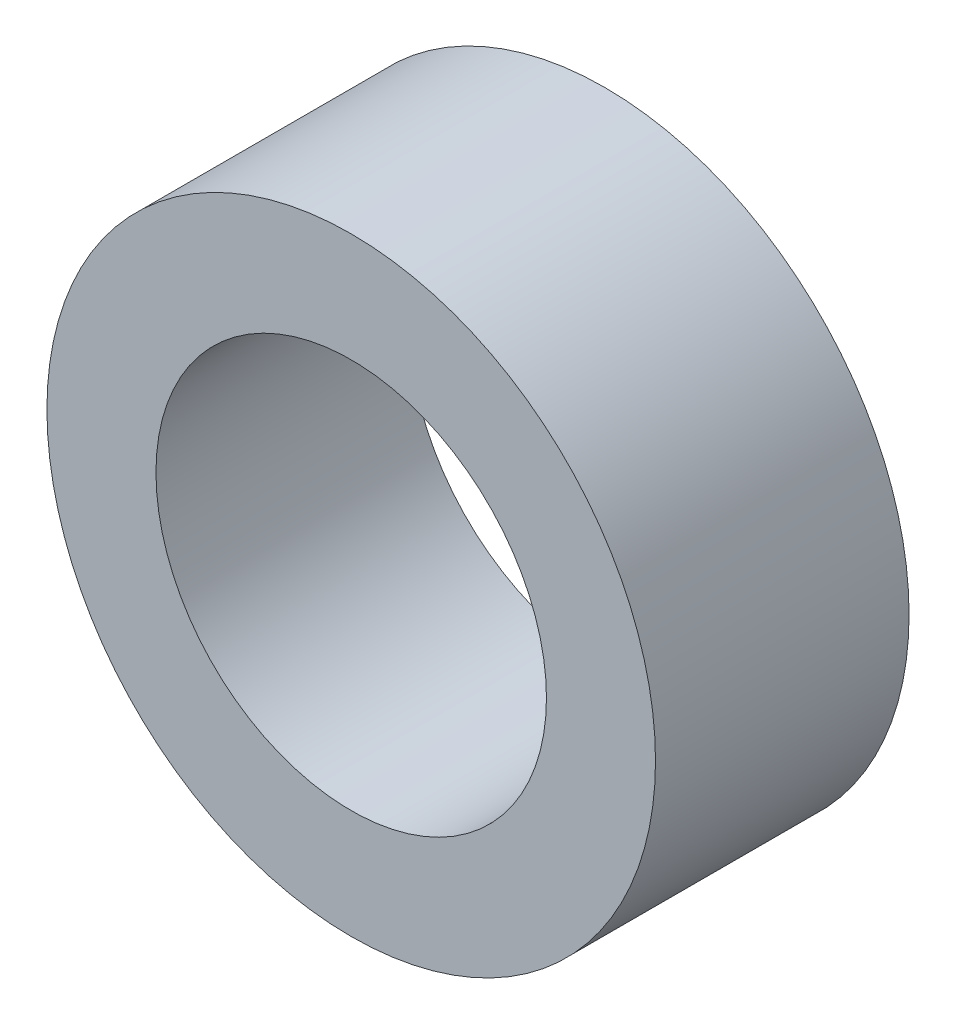
ISO-10303-21;
HEADER;
FILE_DESCRIPTION(('STEP AP214'),'2;1');
FILE_NAME('part.step','',(''),(''),'','','');
FILE_SCHEMA(('AUTOMOTIVE_DESIGN { 1 0 10303 214 1 1 1 1 }'));
ENDSEC;
DATA;
#1=APPLICATION_CONTEXT('core data for automotive mechanical design processes');
#2=APPLICATION_PROTOCOL_DEFINITION('international standard','automotive_design',2000,#1);
#3=PRODUCT_CONTEXT('',#1,'mechanical');
#4=PRODUCT('Part','Part','',(#3));
#5=PRODUCT_RELATED_PRODUCT_CATEGORY('part','',(#4));
#6=PRODUCT_DEFINITION_FORMATION('','',#4);
#7=PRODUCT_DEFINITION_CONTEXT('part definition',#1,'design');
#8=PRODUCT_DEFINITION('design','',#6,#7);
#9=PRODUCT_DEFINITION_SHAPE('','',#8);
#10=(LENGTH_UNIT() NAMED_UNIT(*) SI_UNIT(.MILLI.,.METRE.));
#11=(NAMED_UNIT(*) PLANE_ANGLE_UNIT() SI_UNIT($,.RADIAN.));
#12=(NAMED_UNIT(*) SI_UNIT($,.STERADIAN.) SOLID_ANGLE_UNIT());
#13=UNCERTAINTY_MEASURE_WITH_UNIT(LENGTH_MEASURE(1.E-05),#10,'distance_accuracy_value','');
#14=(GEOMETRIC_REPRESENTATION_CONTEXT(3) GLOBAL_UNCERTAINTY_ASSIGNED_CONTEXT((#13)) GLOBAL_UNIT_ASSIGNED_CONTEXT((#10,
#11,#12)) REPRESENTATION_CONTEXT('',''));
#15=CARTESIAN_POINT('',(0.,0.,0.));
#16=DIRECTION('',(0.,0.,1.));
#17=DIRECTION('',(1.,0.,0.));
#18=AXIS2_PLACEMENT_3D('',#15,#16,#17);
#19=CARTESIAN_POINT('',(0.,0.,5.));
#20=DIRECTION('',(0.,0.,1.));
#21=DIRECTION('',(1.,0.,0.));
#22=AXIS2_PLACEMENT_3D('',#19,#20,#21);
#23=PLANE('',#22);
#24=CARTESIAN_POINT('',(0.,0.,5.));
#25=DIRECTION('',(0.,0.,1.));
#26=DIRECTION('',(1.,0.,0.));
#27=AXIS2_PLACEMENT_3D('',#24,#25,#26);
#28=CIRCLE('',#27,6.);
#29=CARTESIAN_POINT('',(6.,0.,5.));
#30=VERTEX_POINT('',#29);
#31=EDGE_CURVE('E10',#30,#30,#28,.T.);
#32=ORIENTED_EDGE('',*,*,#31,.T.);
#33=EDGE_LOOP('',(#32));
#34=FACE_BOUND('',#33,.T.);
#35=CARTESIAN_POINT('',(0.,0.,5.));
#36=DIRECTION('',(0.,0.,1.));
#37=DIRECTION('',(1.,0.,0.));
#38=AXIS2_PLACEMENT_3D('',#35,#36,#37);
#39=CIRCLE('',#38,3.85);
#40=CARTESIAN_POINT('',(3.85,0.,5.));
#41=VERTEX_POINT('',#40);
#42=EDGE_CURVE('E42',#41,#41,#39,.T.);
#43=ORIENTED_EDGE('',*,*,#42,.F.);
#44=EDGE_LOOP('',(#43));
#45=FACE_BOUND('',#44,.T.);
#46=ADVANCED_FACE('F31',(#34,#45),#23,.T.);
#47=CARTESIAN_POINT('',(0.,0.,0.));
#48=DIRECTION('',(0.,0.,1.));
#49=DIRECTION('',(1.,0.,0.));
#50=AXIS2_PLACEMENT_3D('',#47,#48,#49);
#51=PLANE('',#50);
#52=CARTESIAN_POINT('',(0.,0.,0.));
#53=DIRECTION('',(0.,0.,1.));
#54=DIRECTION('',(1.,0.,0.));
#55=AXIS2_PLACEMENT_3D('',#52,#53,#54);
#56=CIRCLE('',#55,6.);
#57=CARTESIAN_POINT('',(6.,0.,0.));
#58=VERTEX_POINT('',#57);
#59=EDGE_CURVE('E35',#58,#58,#56,.T.);
#60=ORIENTED_EDGE('',*,*,#59,.F.);
#61=EDGE_LOOP('',(#60));
#62=FACE_BOUND('',#61,.T.);
#63=CARTESIAN_POINT('',(0.,0.,0.));
#64=DIRECTION('',(0.,0.,1.));
#65=DIRECTION('',(1.,0.,0.));
#66=AXIS2_PLACEMENT_3D('',#63,#64,#65);
#67=CIRCLE('',#66,3.85);
#68=CARTESIAN_POINT('',(3.85,0.,0.));
#69=VERTEX_POINT('',#68);
#70=EDGE_CURVE('E44',#69,#69,#67,.T.);
#71=ORIENTED_EDGE('',*,*,#70,.T.);
#72=EDGE_LOOP('',(#71));
#73=FACE_BOUND('',#72,.T.);
#74=ADVANCED_FACE('F54',(#62,#73),#51,.F.);
#75=CARTESIAN_POINT('',(0.,0.,5.));
#76=DIRECTION('',(0.,0.,-1.));
#77=DIRECTION('',(-1.,0.,0.));
#78=AXIS2_PLACEMENT_3D('',#75,#76,#77);
#79=CYLINDRICAL_SURFACE('',#78,6.);
#80=ORIENTED_EDGE('',*,*,#31,.F.);
#81=EDGE_LOOP('',(#80));
#82=FACE_BOUND('',#81,.T.);
#83=ORIENTED_EDGE('',*,*,#59,.T.);
#84=EDGE_LOOP('',(#83));
#85=FACE_BOUND('',#84,.T.);
#86=ADVANCED_FACE('F33',(#82,#85),#79,.T.);
#87=CARTESIAN_POINT('',(0.,0.,5.));
#88=DIRECTION('',(0.,0.,-1.));
#89=DIRECTION('',(-1.,0.,0.));
#90=AXIS2_PLACEMENT_3D('',#87,#88,#89);
#91=CYLINDRICAL_SURFACE('',#90,3.85);
#92=ORIENTED_EDGE('',*,*,#42,.T.);
#93=EDGE_LOOP('',(#92));
#94=FACE_BOUND('',#93,.T.);
#95=ORIENTED_EDGE('',*,*,#70,.F.);
#96=EDGE_LOOP('',(#95));
#97=FACE_BOUND('',#96,.T.);
#98=ADVANCED_FACE('F50',(#94,#97),#91,.F.);
#99=CLOSED_SHELL('',(#46,#74,#86,#98));
#100=MANIFOLD_SOLID_BREP('B2',#99);
#101=ADVANCED_BREP_SHAPE_REPRESENTATION('',(#18,#100),#14);
#102=SHAPE_DEFINITION_REPRESENTATION(#9,#101);
ENDSEC;
END-ISO-10303-21;
